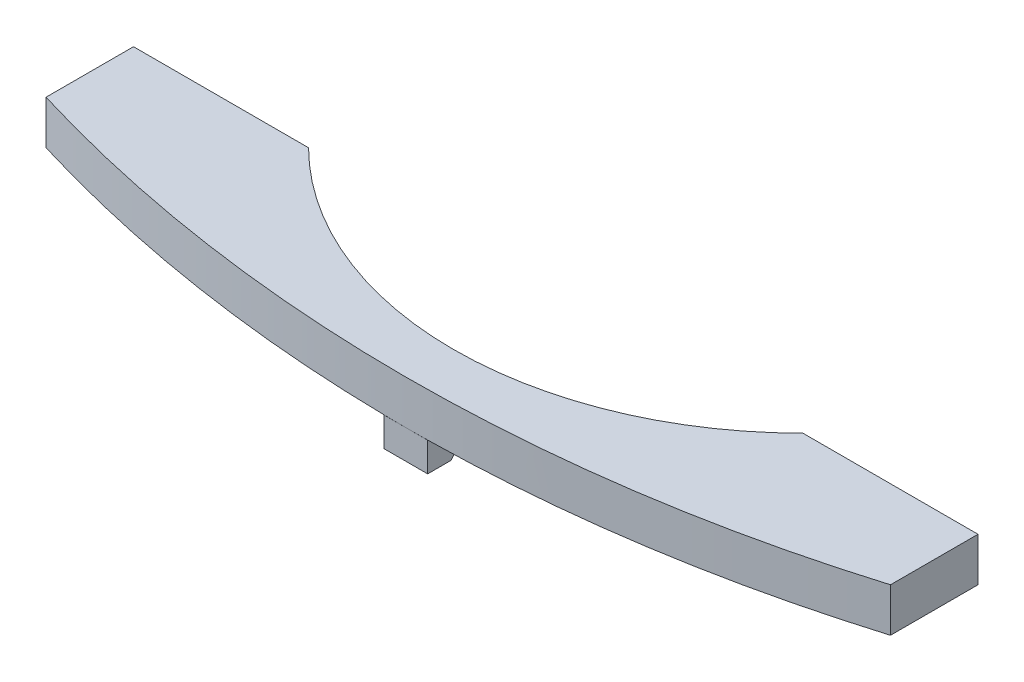
ISO-10303-21;
HEADER;
FILE_DESCRIPTION(('STEP AP214'),'2;1');
FILE_NAME('part.step','',(''),(''),'','','');
FILE_SCHEMA(('AUTOMOTIVE_DESIGN { 1 0 10303 214 1 1 1 1 }'));
ENDSEC;
DATA;
#1=APPLICATION_CONTEXT('core data for automotive mechanical design processes');
#2=APPLICATION_PROTOCOL_DEFINITION('international standard','automotive_design',2000,#1);
#3=PRODUCT_CONTEXT('',#1,'mechanical');
#4=PRODUCT('Part','Part','',(#3));
#5=PRODUCT_RELATED_PRODUCT_CATEGORY('part','',(#4));
#6=PRODUCT_DEFINITION_FORMATION('','',#4);
#7=PRODUCT_DEFINITION_CONTEXT('part definition',#1,'design');
#8=PRODUCT_DEFINITION('design','',#6,#7);
#9=PRODUCT_DEFINITION_SHAPE('','',#8);
#10=(LENGTH_UNIT() NAMED_UNIT(*) SI_UNIT(.MILLI.,.METRE.));
#11=(NAMED_UNIT(*) PLANE_ANGLE_UNIT() SI_UNIT($,.RADIAN.));
#12=(NAMED_UNIT(*) SI_UNIT($,.STERADIAN.) SOLID_ANGLE_UNIT());
#13=UNCERTAINTY_MEASURE_WITH_UNIT(LENGTH_MEASURE(1.E-05),#10,'distance_accuracy_value','');
#14=(GEOMETRIC_REPRESENTATION_CONTEXT(3) GLOBAL_UNCERTAINTY_ASSIGNED_CONTEXT((#13)) GLOBAL_UNIT_ASSIGNED_CONTEXT((#10,
#11,#12)) REPRESENTATION_CONTEXT('',''));
#15=CARTESIAN_POINT('',(0.,0.,0.));
#16=DIRECTION('',(0.,0.,1.));
#17=DIRECTION('',(1.,0.,0.));
#18=AXIS2_PLACEMENT_3D('',#15,#16,#17);
#19=CARTESIAN_POINT('',(91.91625,0.,-53.946744442436));
#20=DIRECTION('',(0.,1.,0.));
#21=DIRECTION('',(0.,0.,1.));
#22=AXIS2_PLACEMENT_3D('',#19,#20,#21);
#23=PLANE('',#22);
#24=DIRECTION('',(0.,0.,1.));
#25=VECTOR('',#24,1.);
#26=CARTESIAN_POINT('',(96.67875,0.,22.253255557564));
#27=LINE('',#26,#25);
#28=CARTESIAN_POINT('',(96.67875,0.,22.253255557564));
#29=VERTEX_POINT('',#28);
#30=CARTESIAN_POINT('',(96.67875,0.,32.6102598760298));
#31=VERTEX_POINT('',#30);
#32=EDGE_CURVE('E258',#29,#31,#27,.T.);
#33=ORIENTED_EDGE('',*,*,#32,.F.);
#34=DIRECTION('',(-1.,0.,0.));
#35=VECTOR('',#34,1.);
#36=CARTESIAN_POINT('',(96.67875,0.,22.253255557564));
#37=LINE('',#36,#35);
#38=CARTESIAN_POINT('',(91.91625,0.,22.253255557564));
#39=VERTEX_POINT('',#38);
#40=EDGE_CURVE('E60',#29,#39,#37,.T.);
#41=ORIENTED_EDGE('',*,*,#40,.T.);
#42=CARTESIAN_POINT('',(91.91625,0.,-53.946744442436));
#43=DIRECTION('',(0.,-1.,0.));
#44=DIRECTION('',(0.,0.,1.));
#45=AXIS2_PLACEMENT_3D('',#42,#43,#44);
#46=CIRCLE('',#45,76.2);
#47=CARTESIAN_POINT('',(145.7325,0.,0.));
#48=VERTEX_POINT('',#47);
#49=EDGE_CURVE('E188',#48,#39,#46,.T.);
#50=ORIENTED_EDGE('',*,*,#49,.F.);
#51=DIRECTION('',(-1.,0.,0.));
#52=VECTOR('',#51,1.);
#53=CARTESIAN_POINT('',(183.8325,0.,0.));
#54=LINE('',#53,#52);
#55=CARTESIAN_POINT('',(183.8325,0.,0.));
#56=VERTEX_POINT('',#55);
#57=EDGE_CURVE('E185',#56,#48,#54,.T.);
#58=ORIENTED_EDGE('',*,*,#57,.F.);
#59=DIRECTION('',(0.,0.,-1.));
#60=VECTOR('',#59,1.);
#61=CARTESIAN_POINT('',(183.8325,0.,0.));
#62=LINE('',#61,#60);
#63=CARTESIAN_POINT('',(183.8325,0.,19.05));
#64=VERTEX_POINT('',#63);
#65=EDGE_CURVE('E152',#64,#56,#62,.T.);
#66=ORIENTED_EDGE('',*,*,#65,.F.);
#67=CARTESIAN_POINT('',(91.91625,0.,-284.854019364564));
#68=DIRECTION('',(0.,1.,0.));
#69=DIRECTION('',(0.,0.,1.));
#70=AXIS2_PLACEMENT_3D('',#67,#68,#69);
#71=CIRCLE('',#70,317.5);
#72=EDGE_CURVE('E177',#31,#64,#71,.T.);
#73=ORIENTED_EDGE('',*,*,#72,.F.);
#74=EDGE_LOOP('',(#33,#41,#50,#58,#66,#73));
#75=FACE_BOUND('',#74,.T.);
#76=ADVANCED_FACE('F49',(#75),#23,.F.);
#77=CARTESIAN_POINT('',(0.,9.525,0.));
#78=DIRECTION('',(0.,0.,1.));
#79=DIRECTION('',(1.,0.,0.));
#80=AXIS2_PLACEMENT_3D('',#77,#78,#79);
#81=PLANE('',#80);
#82=DIRECTION('',(-1.,0.,0.));
#83=VECTOR('',#82,1.);
#84=CARTESIAN_POINT('',(0.,0.,0.));
#85=LINE('',#84,#83);
#86=CARTESIAN_POINT('',(38.1,0.,0.));
#87=VERTEX_POINT('',#86);
#88=CARTESIAN_POINT('',(0.,0.,0.));
#89=VERTEX_POINT('',#88);
#90=EDGE_CURVE('E169',#87,#89,#85,.T.);
#91=ORIENTED_EDGE('',*,*,#90,.T.);
#92=DIRECTION('',(0.,-1.,0.));
#93=VECTOR('',#92,1.);
#94=CARTESIAN_POINT('',(0.,9.525,0.));
#95=LINE('',#94,#93);
#96=CARTESIAN_POINT('',(0.,9.525,0.));
#97=VERTEX_POINT('',#96);
#98=EDGE_CURVE('E53',#97,#89,#95,.T.);
#99=ORIENTED_EDGE('',*,*,#98,.F.);
#100=DIRECTION('',(-1.,0.,0.));
#101=VECTOR('',#100,1.);
#102=CARTESIAN_POINT('',(0.,9.525,0.));
#103=LINE('',#102,#101);
#104=CARTESIAN_POINT('',(38.1,9.525,0.));
#105=VERTEX_POINT('',#104);
#106=EDGE_CURVE('E191',#105,#97,#103,.T.);
#107=ORIENTED_EDGE('',*,*,#106,.F.);
#108=DIRECTION('',(0.,-1.,0.));
#109=VECTOR('',#108,1.);
#110=CARTESIAN_POINT('',(38.1,9.525,0.));
#111=LINE('',#110,#109);
#112=EDGE_CURVE('E165',#105,#87,#111,.T.);
#113=ORIENTED_EDGE('',*,*,#112,.T.);
#114=EDGE_LOOP('',(#91,#99,#107,#113));
#115=FACE_BOUND('',#114,.T.);
#116=ADVANCED_FACE('F51',(#115),#81,.F.);
#117=CARTESIAN_POINT('',(0.,9.525,0.));
#118=DIRECTION('',(1.,0.,0.));
#119=DIRECTION('',(0.,0.,-1.));
#120=AXIS2_PLACEMENT_3D('',#117,#118,#119);
#121=PLANE('',#120);
#122=DIRECTION('',(0.,0.,1.));
#123=VECTOR('',#122,1.);
#124=CARTESIAN_POINT('',(0.,0.,0.));
#125=LINE('',#124,#123);
#126=CARTESIAN_POINT('',(0.,0.,19.05));
#127=VERTEX_POINT('',#126);
#128=EDGE_CURVE('E173',#89,#127,#125,.T.);
#129=ORIENTED_EDGE('',*,*,#128,.T.);
#130=DIRECTION('',(0.,-1.,0.));
#131=VECTOR('',#130,1.);
#132=CARTESIAN_POINT('',(0.,9.525,19.05));
#133=LINE('',#132,#131);
#134=CARTESIAN_POINT('',(0.,9.525,19.05));
#135=VERTEX_POINT('',#134);
#136=EDGE_CURVE('E196',#135,#127,#133,.T.);
#137=ORIENTED_EDGE('',*,*,#136,.F.);
#138=DIRECTION('',(0.,0.,1.));
#139=VECTOR('',#138,1.);
#140=CARTESIAN_POINT('',(0.,9.525,0.));
#141=LINE('',#140,#139);
#142=EDGE_CURVE('E123',#97,#135,#141,.T.);
#143=ORIENTED_EDGE('',*,*,#142,.F.);
#144=ORIENTED_EDGE('',*,*,#98,.T.);
#145=EDGE_LOOP('',(#129,#137,#143,#144));
#146=FACE_BOUND('',#145,.T.);
#147=ADVANCED_FACE('F205',(#146),#121,.F.);
#148=CARTESIAN_POINT('',(91.91625,9.525,-284.854019364564));
#149=DIRECTION('',(0.,-1.,0.));
#150=DIRECTION('',(0.,0.,-1.));
#151=AXIS2_PLACEMENT_3D('',#148,#149,#150);
#152=CYLINDRICAL_SURFACE('',#151,317.5);
#153=CARTESIAN_POINT('',(87.15375,0.,32.6102598760298));
#154=VERTEX_POINT('',#153);
#155=EDGE_CURVE('E178',#127,#154,#71,.T.);
#156=ORIENTED_EDGE('',*,*,#155,.T.);
#157=CARTESIAN_POINT('',(91.91625,0.,32.6459806354357));
#158=VERTEX_POINT('',#157);
#159=EDGE_CURVE('E182',#154,#158,#71,.T.);
#160=ORIENTED_EDGE('',*,*,#159,.T.);
#161=EDGE_CURVE('E286',#158,#31,#71,.T.);
#162=ORIENTED_EDGE('',*,*,#161,.T.);
#163=ORIENTED_EDGE('',*,*,#72,.T.);
#164=DIRECTION('',(0.,-1.,0.));
#165=VECTOR('',#164,1.);
#166=CARTESIAN_POINT('',(183.8325,9.525,19.05));
#167=LINE('',#166,#165);
#168=CARTESIAN_POINT('',(183.8325,9.525,19.05));
#169=VERTEX_POINT('',#168);
#170=EDGE_CURVE('E156',#169,#64,#167,.T.);
#171=ORIENTED_EDGE('',*,*,#170,.F.);
#172=CARTESIAN_POINT('',(91.91625,9.525,-284.854019364564));
#173=DIRECTION('',(0.,1.,0.));
#174=DIRECTION('',(0.,0.,1.));
#175=AXIS2_PLACEMENT_3D('',#172,#173,#174);
#176=CIRCLE('',#175,317.5);
#177=EDGE_CURVE('E142',#135,#169,#176,.T.);
#178=ORIENTED_EDGE('',*,*,#177,.F.);
#179=ORIENTED_EDGE('',*,*,#136,.T.);
#180=EDGE_LOOP('',(#156,#160,#162,#163,#171,#178,#179));
#181=FACE_BOUND('',#180,.T.);
#182=ADVANCED_FACE('F213',(#181),#152,.T.);
#183=CARTESIAN_POINT('',(183.8325,9.525,0.));
#184=DIRECTION('',(-1.,0.,0.));
#185=DIRECTION('',(0.,0.,1.));
#186=AXIS2_PLACEMENT_3D('',#183,#184,#185);
#187=PLANE('',#186);
#188=ORIENTED_EDGE('',*,*,#65,.T.);
#189=DIRECTION('',(0.,-1.,0.));
#190=VECTOR('',#189,1.);
#191=CARTESIAN_POINT('',(183.8325,9.525,0.));
#192=LINE('',#191,#190);
#193=CARTESIAN_POINT('',(183.8325,9.525,0.));
#194=VERTEX_POINT('',#193);
#195=EDGE_CURVE('E149',#194,#56,#192,.T.);
#196=ORIENTED_EDGE('',*,*,#195,.F.);
#197=DIRECTION('',(0.,0.,-1.));
#198=VECTOR('',#197,1.);
#199=CARTESIAN_POINT('',(183.8325,9.525,0.));
#200=LINE('',#199,#198);
#201=EDGE_CURVE('E135',#169,#194,#200,.T.);
#202=ORIENTED_EDGE('',*,*,#201,.F.);
#203=ORIENTED_EDGE('',*,*,#170,.T.);
#204=EDGE_LOOP('',(#188,#196,#202,#203));
#205=FACE_BOUND('',#204,.T.);
#206=ADVANCED_FACE('F150',(#205),#187,.F.);
#207=CARTESIAN_POINT('',(183.8325,9.525,0.));
#208=DIRECTION('',(0.,0.,1.));
#209=DIRECTION('',(1.,0.,0.));
#210=AXIS2_PLACEMENT_3D('',#207,#208,#209);
#211=PLANE('',#210);
#212=ORIENTED_EDGE('',*,*,#57,.T.);
#213=DIRECTION('',(0.,-1.,0.));
#214=VECTOR('',#213,1.);
#215=CARTESIAN_POINT('',(145.7325,9.525,0.));
#216=LINE('',#215,#214);
#217=CARTESIAN_POINT('',(145.7325,9.525,0.));
#218=VERTEX_POINT('',#217);
#219=EDGE_CURVE('E157',#218,#48,#216,.T.);
#220=ORIENTED_EDGE('',*,*,#219,.F.);
#221=DIRECTION('',(-1.,0.,0.));
#222=VECTOR('',#221,1.);
#223=CARTESIAN_POINT('',(183.8325,9.525,0.));
#224=LINE('',#223,#222);
#225=EDGE_CURVE('E139',#194,#218,#224,.T.);
#226=ORIENTED_EDGE('',*,*,#225,.F.);
#227=ORIENTED_EDGE('',*,*,#195,.T.);
#228=EDGE_LOOP('',(#212,#220,#226,#227));
#229=FACE_BOUND('',#228,.T.);
#230=ADVANCED_FACE('F159',(#229),#211,.F.);
#231=CARTESIAN_POINT('',(91.91625,9.525,-53.946744442436));
#232=DIRECTION('',(0.,-1.,0.));
#233=DIRECTION('',(0.,0.,-1.));
#234=AXIS2_PLACEMENT_3D('',#231,#232,#233);
#235=CYLINDRICAL_SURFACE('',#234,76.2);
#236=ORIENTED_EDGE('',*,*,#49,.T.);
#237=EDGE_CURVE('E113',#39,#87,#46,.T.);
#238=ORIENTED_EDGE('',*,*,#237,.T.);
#239=ORIENTED_EDGE('',*,*,#112,.F.);
#240=CARTESIAN_POINT('',(91.91625,9.525,-53.946744442436));
#241=DIRECTION('',(0.,-1.,0.));
#242=DIRECTION('',(0.,0.,1.));
#243=AXIS2_PLACEMENT_3D('',#240,#241,#242);
#244=CIRCLE('',#243,76.2);
#245=EDGE_CURVE('E81',#218,#105,#244,.T.);
#246=ORIENTED_EDGE('',*,*,#245,.F.);
#247=ORIENTED_EDGE('',*,*,#219,.T.);
#248=EDGE_LOOP('',(#236,#238,#239,#246,#247));
#249=FACE_BOUND('',#248,.T.);
#250=ADVANCED_FACE('F349',(#249),#235,.F.);
#251=CARTESIAN_POINT('',(91.91625,9.525,-53.946744442436));
#252=DIRECTION('',(0.,1.,0.));
#253=DIRECTION('',(0.,0.,1.));
#254=AXIS2_PLACEMENT_3D('',#251,#252,#253);
#255=PLANE('',#254);
#256=ORIENTED_EDGE('',*,*,#106,.T.);
#257=ORIENTED_EDGE('',*,*,#142,.T.);
#258=ORIENTED_EDGE('',*,*,#177,.T.);
#259=ORIENTED_EDGE('',*,*,#201,.T.);
#260=ORIENTED_EDGE('',*,*,#225,.T.);
#261=ORIENTED_EDGE('',*,*,#245,.T.);
#262=EDGE_LOOP('',(#256,#257,#258,#259,#260,#261));
#263=FACE_BOUND('',#262,.T.);
#264=ADVANCED_FACE('F137',(#263),#255,.T.);
#265=CARTESIAN_POINT('',(87.15375,0.,22.253255557564));
#266=VERTEX_POINT('',#265);
#267=EDGE_CURVE('E11',#39,#266,#37,.T.);
#268=ORIENTED_EDGE('',*,*,#267,.T.);
#269=DIRECTION('',(0.,0.,1.));
#270=VECTOR('',#269,1.);
#271=CARTESIAN_POINT('',(87.15375,0.,22.253255557564));
#272=LINE('',#271,#270);
#273=EDGE_CURVE('E69',#266,#154,#272,.T.);
#274=ORIENTED_EDGE('',*,*,#273,.T.);
#275=ORIENTED_EDGE('',*,*,#155,.F.);
#276=ORIENTED_EDGE('',*,*,#128,.F.);
#277=ORIENTED_EDGE('',*,*,#90,.F.);
#278=ORIENTED_EDGE('',*,*,#237,.F.);
#279=EDGE_LOOP('',(#268,#274,#275,#276,#277,#278));
#280=FACE_BOUND('',#279,.T.);
#281=ADVANCED_FACE('F210',(#280),#23,.F.);
#282=CARTESIAN_POINT('',(96.67875,0.,22.253255557564));
#283=DIRECTION('',(0.,-1.,0.));
#284=DIRECTION('',(0.,0.,-1.));
#285=AXIS2_PLACEMENT_3D('',#282,#283,#284);
#286=PLANE('',#285);
#287=ORIENTED_EDGE('',*,*,#159,.F.);
#288=CARTESIAN_POINT('',(87.15375,0.,32.6459806354357));
#289=VERTEX_POINT('',#288);
#290=EDGE_CURVE('E294',#154,#289,#272,.T.);
#291=ORIENTED_EDGE('',*,*,#290,.T.);
#292=DIRECTION('',(-1.,0.,0.));
#293=VECTOR('',#292,1.);
#294=CARTESIAN_POINT('',(96.67875,0.,32.6459806354357));
#295=LINE('',#294,#293);
#296=EDGE_CURVE('E274',#158,#289,#295,.T.);
#297=ORIENTED_EDGE('',*,*,#296,.F.);
#298=EDGE_LOOP('',(#287,#291,#297));
#299=FACE_BOUND('',#298,.T.);
#300=ADVANCED_FACE('F332',(#299),#286,.F.);
#301=ORIENTED_EDGE('',*,*,#161,.F.);
#302=CARTESIAN_POINT('',(96.67875,0.,32.6459806354357));
#303=VERTEX_POINT('',#302);
#304=EDGE_CURVE('E174',#303,#158,#295,.T.);
#305=ORIENTED_EDGE('',*,*,#304,.F.);
#306=EDGE_CURVE('E243',#31,#303,#27,.T.);
#307=ORIENTED_EDGE('',*,*,#306,.F.);
#308=EDGE_LOOP('',(#301,#305,#307));
#309=FACE_BOUND('',#308,.T.);
#310=ADVANCED_FACE('F331',(#309),#286,.F.);
#311=CARTESIAN_POINT('',(96.67875,0.,32.6459806354357));
#312=DIRECTION('',(0.,0.,-1.));
#313=DIRECTION('',(-1.,0.,0.));
#314=AXIS2_PLACEMENT_3D('',#311,#312,#313);
#315=PLANE('',#314);
#316=DIRECTION('',(0.,-1.,0.));
#317=VECTOR('',#316,1.);
#318=CARTESIAN_POINT('',(87.15375,0.,32.6459806354357));
#319=LINE('',#318,#317);
#320=CARTESIAN_POINT('',(87.15375,-6.35,32.6459806354357));
#321=VERTEX_POINT('',#320);
#322=EDGE_CURVE('E300',#289,#321,#319,.T.);
#323=ORIENTED_EDGE('',*,*,#322,.T.);
#324=DIRECTION('',(-1.,0.,0.));
#325=VECTOR('',#324,1.);
#326=CARTESIAN_POINT('',(96.67875,-6.35,32.6459806354357));
#327=LINE('',#326,#325);
#328=CARTESIAN_POINT('',(96.67875,-6.35,32.6459806354357));
#329=VERTEX_POINT('',#328);
#330=EDGE_CURVE('E263',#329,#321,#327,.T.);
#331=ORIENTED_EDGE('',*,*,#330,.F.);
#332=DIRECTION('',(0.,-1.,0.));
#333=VECTOR('',#332,1.);
#334=CARTESIAN_POINT('',(96.67875,0.,32.6459806354357));
#335=LINE('',#334,#333);
#336=EDGE_CURVE('E284',#303,#329,#335,.T.);
#337=ORIENTED_EDGE('',*,*,#336,.F.);
#338=ORIENTED_EDGE('',*,*,#304,.T.);
#339=ORIENTED_EDGE('',*,*,#296,.T.);
#340=EDGE_LOOP('',(#323,#331,#337,#338,#339));
#341=FACE_BOUND('',#340,.T.);
#342=ADVANCED_FACE('F313',(#341),#315,.F.);
#343=CARTESIAN_POINT('',(96.67875,-6.35,32.6459806354357));
#344=DIRECTION('',(0.,1.,0.));
#345=DIRECTION('',(0.,0.,1.));
#346=AXIS2_PLACEMENT_3D('',#343,#344,#345);
#347=PLANE('',#346);
#348=DIRECTION('',(0.,0.,-1.));
#349=VECTOR('',#348,1.);
#350=CARTESIAN_POINT('',(87.15375,-6.35,32.6459806354357));
#351=LINE('',#350,#349);
#352=CARTESIAN_POINT('',(87.15375,-6.35,27.5815382155398));
#353=VERTEX_POINT('',#352);
#354=EDGE_CURVE('E302',#321,#353,#351,.T.);
#355=ORIENTED_EDGE('',*,*,#354,.T.);
#356=DIRECTION('',(-1.,0.,0.));
#357=VECTOR('',#356,1.);
#358=CARTESIAN_POINT('',(96.67875,-6.35,27.5815382155398));
#359=LINE('',#358,#357);
#360=CARTESIAN_POINT('',(96.67875,-6.35,27.5815382155398));
#361=VERTEX_POINT('',#360);
#362=EDGE_CURVE('E260',#361,#353,#359,.T.);
#363=ORIENTED_EDGE('',*,*,#362,.F.);
#364=DIRECTION('',(0.,0.,-1.));
#365=VECTOR('',#364,1.);
#366=CARTESIAN_POINT('',(96.67875,-6.35,32.6459806354357));
#367=LINE('',#366,#365);
#368=EDGE_CURVE('E266',#329,#361,#367,.T.);
#369=ORIENTED_EDGE('',*,*,#368,.F.);
#370=ORIENTED_EDGE('',*,*,#330,.T.);
#371=EDGE_LOOP('',(#355,#363,#369,#370));
#372=FACE_BOUND('',#371,.T.);
#373=ADVANCED_FACE('F320',(#372),#347,.F.);
#374=CARTESIAN_POINT('',(96.67875,-6.35,27.5815382155398));
#375=DIRECTION('',(0.,0.642787609686543,0.766044443118975));
#376=DIRECTION('',(0.,-0.766044443118975,0.642787609686543));
#377=AXIS2_PLACEMENT_3D('',#374,#375,#376);
#378=PLANE('',#377);
#379=DIRECTION('',(0.,0.766044443118975,-0.642787609686543));
#380=VECTOR('',#379,1.);
#381=CARTESIAN_POINT('',(87.15375,-6.35,27.5815382155398));
#382=LINE('',#381,#380);
#383=EDGE_CURVE('E254',#353,#266,#382,.T.);
#384=ORIENTED_EDGE('',*,*,#383,.T.);
#385=ORIENTED_EDGE('',*,*,#267,.F.);
#386=ORIENTED_EDGE('',*,*,#40,.F.);
#387=DIRECTION('',(0.,0.766044443118975,-0.642787609686543));
#388=VECTOR('',#387,1.);
#389=CARTESIAN_POINT('',(96.67875,-6.35,27.5815382155398));
#390=LINE('',#389,#388);
#391=EDGE_CURVE('E261',#361,#29,#390,.T.);
#392=ORIENTED_EDGE('',*,*,#391,.F.);
#393=ORIENTED_EDGE('',*,*,#362,.T.);
#394=EDGE_LOOP('',(#384,#385,#386,#392,#393));
#395=FACE_BOUND('',#394,.T.);
#396=ADVANCED_FACE('F250',(#395),#378,.F.);
#397=CARTESIAN_POINT('',(96.67875,0.,0.));
#398=DIRECTION('',(1.,0.,0.));
#399=DIRECTION('',(0.,0.,-1.));
#400=AXIS2_PLACEMENT_3D('',#397,#398,#399);
#401=PLANE('',#400);
#402=ORIENTED_EDGE('',*,*,#32,.T.);
#403=ORIENTED_EDGE('',*,*,#306,.T.);
#404=ORIENTED_EDGE('',*,*,#336,.T.);
#405=ORIENTED_EDGE('',*,*,#368,.T.);
#406=ORIENTED_EDGE('',*,*,#391,.T.);
#407=EDGE_LOOP('',(#402,#403,#404,#405,#406));
#408=FACE_BOUND('',#407,.T.);
#409=ADVANCED_FACE('F330',(#408),#401,.T.);
#410=CARTESIAN_POINT('',(87.15375,0.,0.));
#411=DIRECTION('',(1.,0.,0.));
#412=DIRECTION('',(0.,0.,-1.));
#413=AXIS2_PLACEMENT_3D('',#410,#411,#412);
#414=PLANE('',#413);
#415=ORIENTED_EDGE('',*,*,#273,.F.);
#416=ORIENTED_EDGE('',*,*,#383,.F.);
#417=ORIENTED_EDGE('',*,*,#354,.F.);
#418=ORIENTED_EDGE('',*,*,#322,.F.);
#419=ORIENTED_EDGE('',*,*,#290,.F.);
#420=EDGE_LOOP('',(#415,#416,#417,#418,#419));
#421=FACE_BOUND('',#420,.T.);
#422=ADVANCED_FACE('F322',(#421),#414,.F.);
#423=CLOSED_SHELL('',(#76,#116,#147,#182,#206,#230,#250,#264,#281,#300,#310,#342,#373,#396,#409,#422));
#424=MANIFOLD_SOLID_BREP('B2',#423);
#425=ADVANCED_BREP_SHAPE_REPRESENTATION('',(#18,#424),#14);
#426=SHAPE_DEFINITION_REPRESENTATION(#9,#425);
ENDSEC;
END-ISO-10303-21;
